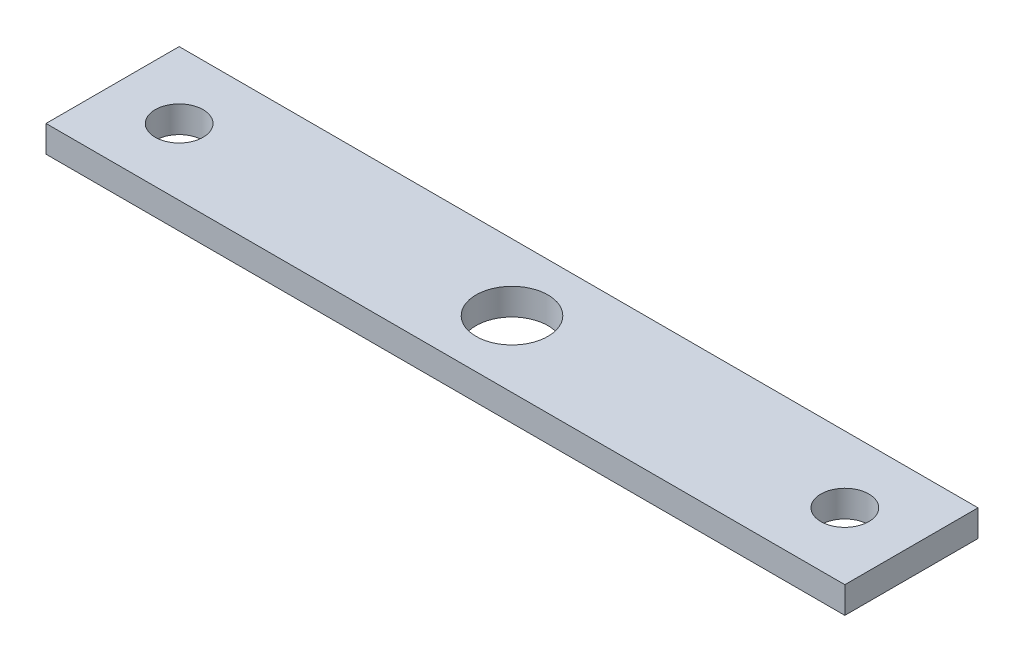
ISO-10303-21;
HEADER;
FILE_DESCRIPTION(('STEP AP214'),'2;1');
FILE_NAME('part.step','',(''),(''),'','','');
FILE_SCHEMA(('AUTOMOTIVE_DESIGN { 1 0 10303 214 1 1 1 1 }'));
ENDSEC;
DATA;
#1=APPLICATION_CONTEXT('core data for automotive mechanical design processes');
#2=APPLICATION_PROTOCOL_DEFINITION('international standard','automotive_design',2000,#1);
#3=PRODUCT_CONTEXT('',#1,'mechanical');
#4=PRODUCT('Part','Part','',(#3));
#5=PRODUCT_RELATED_PRODUCT_CATEGORY('part','',(#4));
#6=PRODUCT_DEFINITION_FORMATION('','',#4);
#7=PRODUCT_DEFINITION_CONTEXT('part definition',#1,'design');
#8=PRODUCT_DEFINITION('design','',#6,#7);
#9=PRODUCT_DEFINITION_SHAPE('','',#8);
#10=(LENGTH_UNIT() NAMED_UNIT(*) SI_UNIT(.MILLI.,.METRE.));
#11=(NAMED_UNIT(*) PLANE_ANGLE_UNIT() SI_UNIT($,.RADIAN.));
#12=(NAMED_UNIT(*) SI_UNIT($,.STERADIAN.) SOLID_ANGLE_UNIT());
#13=UNCERTAINTY_MEASURE_WITH_UNIT(LENGTH_MEASURE(1.E-05),#10,'distance_accuracy_value','');
#14=(GEOMETRIC_REPRESENTATION_CONTEXT(3) GLOBAL_UNCERTAINTY_ASSIGNED_CONTEXT((#13)) GLOBAL_UNIT_ASSIGNED_CONTEXT((#10,
#11,#12)) REPRESENTATION_CONTEXT('',''));
#15=CARTESIAN_POINT('',(0.,0.,0.));
#16=DIRECTION('',(0.,0.,1.));
#17=DIRECTION('',(1.,0.,0.));
#18=AXIS2_PLACEMENT_3D('',#15,#16,#17);
#19=CARTESIAN_POINT('',(0.,2.54,0.));
#20=DIRECTION('',(0.,1.,0.));
#21=DIRECTION('',(0.,0.,1.));
#22=AXIS2_PLACEMENT_3D('',#19,#20,#21);
#23=PLANE('',#22);
#24=CARTESIAN_POINT('',(31.75,2.54,0.));
#25=DIRECTION('',(0.,1.,0.));
#26=DIRECTION('',(0.,0.,1.));
#27=AXIS2_PLACEMENT_3D('',#24,#25,#26);
#28=CIRCLE('',#27,2.28599999999999);
#29=CARTESIAN_POINT('',(31.75,2.54,2.28599999999999));
#30=VERTEX_POINT('',#29);
#31=EDGE_CURVE('E117',#30,#30,#28,.T.);
#32=ORIENTED_EDGE('',*,*,#31,.F.);
#33=EDGE_LOOP('',(#32));
#34=FACE_BOUND('',#33,.T.);
#35=DIRECTION('',(0.,0.,-1.));
#36=VECTOR('',#35,1.);
#37=CARTESIAN_POINT('',(38.1,2.54,-6.35));
#38=LINE('',#37,#36);
#39=CARTESIAN_POINT('',(38.1,2.54,6.35));
#40=VERTEX_POINT('',#39);
#41=CARTESIAN_POINT('',(38.1,2.54,-6.35));
#42=VERTEX_POINT('',#41);
#43=EDGE_CURVE('E87',#40,#42,#38,.T.);
#44=ORIENTED_EDGE('',*,*,#43,.T.);
#45=DIRECTION('',(-1.,0.,0.));
#46=VECTOR('',#45,1.);
#47=CARTESIAN_POINT('',(-38.1,2.54,-6.35));
#48=LINE('',#47,#46);
#49=CARTESIAN_POINT('',(-38.1,2.54,-6.35));
#50=VERTEX_POINT('',#49);
#51=EDGE_CURVE('E82',#42,#50,#48,.T.);
#52=ORIENTED_EDGE('',*,*,#51,.T.);
#53=DIRECTION('',(0.,0.,1.));
#54=VECTOR('',#53,1.);
#55=CARTESIAN_POINT('',(-38.1,2.54,-6.35));
#56=LINE('',#55,#54);
#57=CARTESIAN_POINT('',(-38.1,2.54,6.35));
#58=VERTEX_POINT('',#57);
#59=EDGE_CURVE('E85',#50,#58,#56,.T.);
#60=ORIENTED_EDGE('',*,*,#59,.T.);
#61=DIRECTION('',(1.,0.,0.));
#62=VECTOR('',#61,1.);
#63=CARTESIAN_POINT('',(-38.1,2.54,6.35));
#64=LINE('',#63,#62);
#65=EDGE_CURVE('E52',#58,#40,#64,.T.);
#66=ORIENTED_EDGE('',*,*,#65,.T.);
#67=EDGE_LOOP('',(#44,#52,#60,#66));
#68=FACE_BOUND('',#67,.T.);
#69=CARTESIAN_POINT('',(0.,2.54,0.));
#70=DIRECTION('',(0.,1.,0.));
#71=DIRECTION('',(0.,0.,1.));
#72=AXIS2_PLACEMENT_3D('',#69,#70,#71);
#73=CIRCLE('',#72,3.429);
#74=CARTESIAN_POINT('',(0.,2.54,3.429));
#75=VERTEX_POINT('',#74);
#76=EDGE_CURVE('E102',#75,#75,#73,.T.);
#77=ORIENTED_EDGE('',*,*,#76,.F.);
#78=EDGE_LOOP('',(#77));
#79=FACE_BOUND('',#78,.T.);
#80=CARTESIAN_POINT('',(-31.75,2.54,0.));
#81=DIRECTION('',(0.,1.,0.));
#82=DIRECTION('',(0.,0.,1.));
#83=AXIS2_PLACEMENT_3D('',#80,#81,#82);
#84=CIRCLE('',#83,2.286);
#85=CARTESIAN_POINT('',(-31.75,2.54,2.286));
#86=VERTEX_POINT('',#85);
#87=EDGE_CURVE('E123',#86,#86,#84,.T.);
#88=ORIENTED_EDGE('',*,*,#87,.F.);
#89=EDGE_LOOP('',(#88));
#90=FACE_BOUND('',#89,.T.);
#91=ADVANCED_FACE('F35',(#34,#68,#79,#90),#23,.T.);
#92=CARTESIAN_POINT('',(0.,0.,0.));
#93=DIRECTION('',(0.,1.,0.));
#94=DIRECTION('',(0.,0.,1.));
#95=AXIS2_PLACEMENT_3D('',#92,#93,#94);
#96=PLANE('',#95);
#97=DIRECTION('',(0.,0.,-1.));
#98=VECTOR('',#97,1.);
#99=CARTESIAN_POINT('',(38.1,0.,-6.35));
#100=LINE('',#99,#98);
#101=CARTESIAN_POINT('',(38.1,0.,6.35));
#102=VERTEX_POINT('',#101);
#103=CARTESIAN_POINT('',(38.1,0.,-6.35));
#104=VERTEX_POINT('',#103);
#105=EDGE_CURVE('E99',#102,#104,#100,.T.);
#106=ORIENTED_EDGE('',*,*,#105,.F.);
#107=DIRECTION('',(1.,0.,0.));
#108=VECTOR('',#107,1.);
#109=CARTESIAN_POINT('',(-38.1,0.,6.35));
#110=LINE('',#109,#108);
#111=CARTESIAN_POINT('',(-38.1,0.,6.35));
#112=VERTEX_POINT('',#111);
#113=EDGE_CURVE('E75',#112,#102,#110,.T.);
#114=ORIENTED_EDGE('',*,*,#113,.F.);
#115=DIRECTION('',(0.,0.,1.));
#116=VECTOR('',#115,1.);
#117=CARTESIAN_POINT('',(-38.1,0.,-6.35));
#118=LINE('',#117,#116);
#119=CARTESIAN_POINT('',(-38.1,0.,-6.35));
#120=VERTEX_POINT('',#119);
#121=EDGE_CURVE('E69',#120,#112,#118,.T.);
#122=ORIENTED_EDGE('',*,*,#121,.F.);
#123=DIRECTION('',(-1.,0.,0.));
#124=VECTOR('',#123,1.);
#125=CARTESIAN_POINT('',(-38.1,0.,-6.35));
#126=LINE('',#125,#124);
#127=EDGE_CURVE('E91',#104,#120,#126,.T.);
#128=ORIENTED_EDGE('',*,*,#127,.F.);
#129=EDGE_LOOP('',(#106,#114,#122,#128));
#130=FACE_BOUND('',#129,.T.);
#131=CARTESIAN_POINT('',(0.,0.,0.));
#132=DIRECTION('',(0.,1.,0.));
#133=DIRECTION('',(0.,0.,1.));
#134=AXIS2_PLACEMENT_3D('',#131,#132,#133);
#135=CIRCLE('',#134,3.429);
#136=CARTESIAN_POINT('',(0.,0.,3.429));
#137=VERTEX_POINT('',#136);
#138=EDGE_CURVE('E114',#137,#137,#135,.T.);
#139=ORIENTED_EDGE('',*,*,#138,.T.);
#140=EDGE_LOOP('',(#139));
#141=FACE_BOUND('',#140,.T.);
#142=CARTESIAN_POINT('',(31.75,0.,0.));
#143=DIRECTION('',(0.,1.,0.));
#144=DIRECTION('',(0.,0.,1.));
#145=AXIS2_PLACEMENT_3D('',#142,#143,#144);
#146=CIRCLE('',#145,2.28599999999999);
#147=CARTESIAN_POINT('',(31.75,0.,2.28599999999999));
#148=VERTEX_POINT('',#147);
#149=EDGE_CURVE('E120',#148,#148,#146,.T.);
#150=ORIENTED_EDGE('',*,*,#149,.T.);
#151=EDGE_LOOP('',(#150));
#152=FACE_BOUND('',#151,.T.);
#153=CARTESIAN_POINT('',(-31.75,0.,0.));
#154=DIRECTION('',(0.,1.,0.));
#155=DIRECTION('',(0.,0.,1.));
#156=AXIS2_PLACEMENT_3D('',#153,#154,#155);
#157=CIRCLE('',#156,2.286);
#158=CARTESIAN_POINT('',(-31.75,0.,2.286));
#159=VERTEX_POINT('',#158);
#160=EDGE_CURVE('E126',#159,#159,#157,.T.);
#161=ORIENTED_EDGE('',*,*,#160,.T.);
#162=EDGE_LOOP('',(#161));
#163=FACE_BOUND('',#162,.T.);
#164=ADVANCED_FACE('F110',(#130,#141,#152,#163),#96,.F.);
#165=CARTESIAN_POINT('',(38.1,2.54,-6.35));
#166=DIRECTION('',(-1.,0.,0.));
#167=DIRECTION('',(0.,0.,1.));
#168=AXIS2_PLACEMENT_3D('',#165,#166,#167);
#169=PLANE('',#168);
#170=ORIENTED_EDGE('',*,*,#105,.T.);
#171=DIRECTION('',(0.,-1.,0.));
#172=VECTOR('',#171,1.);
#173=CARTESIAN_POINT('',(38.1,2.54,-6.35));
#174=LINE('',#173,#172);
#175=EDGE_CURVE('E11',#42,#104,#174,.T.);
#176=ORIENTED_EDGE('',*,*,#175,.F.);
#177=ORIENTED_EDGE('',*,*,#43,.F.);
#178=DIRECTION('',(0.,-1.,0.));
#179=VECTOR('',#178,1.);
#180=CARTESIAN_POINT('',(38.1,2.54,6.35));
#181=LINE('',#180,#179);
#182=EDGE_CURVE('E95',#40,#102,#181,.T.);
#183=ORIENTED_EDGE('',*,*,#182,.T.);
#184=EDGE_LOOP('',(#170,#176,#177,#183));
#185=FACE_BOUND('',#184,.T.);
#186=ADVANCED_FACE('F37',(#185),#169,.F.);
#187=CARTESIAN_POINT('',(-38.1,2.54,-6.35));
#188=DIRECTION('',(0.,0.,1.));
#189=DIRECTION('',(1.,0.,0.));
#190=AXIS2_PLACEMENT_3D('',#187,#188,#189);
#191=PLANE('',#190);
#192=ORIENTED_EDGE('',*,*,#127,.T.);
#193=DIRECTION('',(0.,-1.,0.));
#194=VECTOR('',#193,1.);
#195=CARTESIAN_POINT('',(-38.1,2.54,-6.35));
#196=LINE('',#195,#194);
#197=EDGE_CURVE('E44',#50,#120,#196,.T.);
#198=ORIENTED_EDGE('',*,*,#197,.F.);
#199=ORIENTED_EDGE('',*,*,#51,.F.);
#200=ORIENTED_EDGE('',*,*,#175,.T.);
#201=EDGE_LOOP('',(#192,#198,#199,#200));
#202=FACE_BOUND('',#201,.T.);
#203=ADVANCED_FACE('F90',(#202),#191,.F.);
#204=CARTESIAN_POINT('',(-38.1,2.54,-6.35));
#205=DIRECTION('',(1.,0.,0.));
#206=DIRECTION('',(0.,0.,-1.));
#207=AXIS2_PLACEMENT_3D('',#204,#205,#206);
#208=PLANE('',#207);
#209=ORIENTED_EDGE('',*,*,#121,.T.);
#210=DIRECTION('',(0.,-1.,0.));
#211=VECTOR('',#210,1.);
#212=CARTESIAN_POINT('',(-38.1,2.54,6.35));
#213=LINE('',#212,#211);
#214=EDGE_CURVE('E92',#58,#112,#213,.T.);
#215=ORIENTED_EDGE('',*,*,#214,.F.);
#216=ORIENTED_EDGE('',*,*,#59,.F.);
#217=ORIENTED_EDGE('',*,*,#197,.T.);
#218=EDGE_LOOP('',(#209,#215,#216,#217));
#219=FACE_BOUND('',#218,.T.);
#220=ADVANCED_FACE('F93',(#219),#208,.F.);
#221=CARTESIAN_POINT('',(-38.1,2.54,6.35));
#222=DIRECTION('',(0.,0.,-1.));
#223=DIRECTION('',(-1.,0.,0.));
#224=AXIS2_PLACEMENT_3D('',#221,#222,#223);
#225=PLANE('',#224);
#226=ORIENTED_EDGE('',*,*,#113,.T.);
#227=ORIENTED_EDGE('',*,*,#182,.F.);
#228=ORIENTED_EDGE('',*,*,#65,.F.);
#229=ORIENTED_EDGE('',*,*,#214,.T.);
#230=EDGE_LOOP('',(#226,#227,#228,#229));
#231=FACE_BOUND('',#230,.T.);
#232=ADVANCED_FACE('F107',(#231),#225,.F.);
#233=CARTESIAN_POINT('',(0.,2.54,0.));
#234=DIRECTION('',(0.,-1.,0.));
#235=DIRECTION('',(0.,0.,-1.));
#236=AXIS2_PLACEMENT_3D('',#233,#234,#235);
#237=CYLINDRICAL_SURFACE('',#236,3.429);
#238=ORIENTED_EDGE('',*,*,#76,.T.);
#239=EDGE_LOOP('',(#238));
#240=FACE_BOUND('',#239,.T.);
#241=ORIENTED_EDGE('',*,*,#138,.F.);
#242=EDGE_LOOP('',(#241));
#243=FACE_BOUND('',#242,.T.);
#244=ADVANCED_FACE('F144',(#240,#243),#237,.F.);
#245=CARTESIAN_POINT('',(31.75,2.54,0.));
#246=DIRECTION('',(0.,-1.,0.));
#247=DIRECTION('',(0.,0.,-1.));
#248=AXIS2_PLACEMENT_3D('',#245,#246,#247);
#249=CYLINDRICAL_SURFACE('',#248,2.28599999999999);
#250=ORIENTED_EDGE('',*,*,#31,.T.);
#251=EDGE_LOOP('',(#250));
#252=FACE_BOUND('',#251,.T.);
#253=ORIENTED_EDGE('',*,*,#149,.F.);
#254=EDGE_LOOP('',(#253));
#255=FACE_BOUND('',#254,.T.);
#256=ADVANCED_FACE('F190',(#252,#255),#249,.F.);
#257=CARTESIAN_POINT('',(-31.75,2.54,0.));
#258=DIRECTION('',(0.,-1.,0.));
#259=DIRECTION('',(0.,0.,-1.));
#260=AXIS2_PLACEMENT_3D('',#257,#258,#259);
#261=CYLINDRICAL_SURFACE('',#260,2.286);
#262=ORIENTED_EDGE('',*,*,#87,.T.);
#263=EDGE_LOOP('',(#262));
#264=FACE_BOUND('',#263,.T.);
#265=ORIENTED_EDGE('',*,*,#160,.F.);
#266=EDGE_LOOP('',(#265));
#267=FACE_BOUND('',#266,.T.);
#268=ADVANCED_FACE('F132',(#264,#267),#261,.F.);
#269=CLOSED_SHELL('',(#91,#164,#186,#203,#220,#232,#244,#256,#268));
#270=MANIFOLD_SOLID_BREP('B2',#269);
#271=ADVANCED_BREP_SHAPE_REPRESENTATION('',(#18,#270),#14);
#272=SHAPE_DEFINITION_REPRESENTATION(#9,#271);
ENDSEC;
END-ISO-10303-21;
